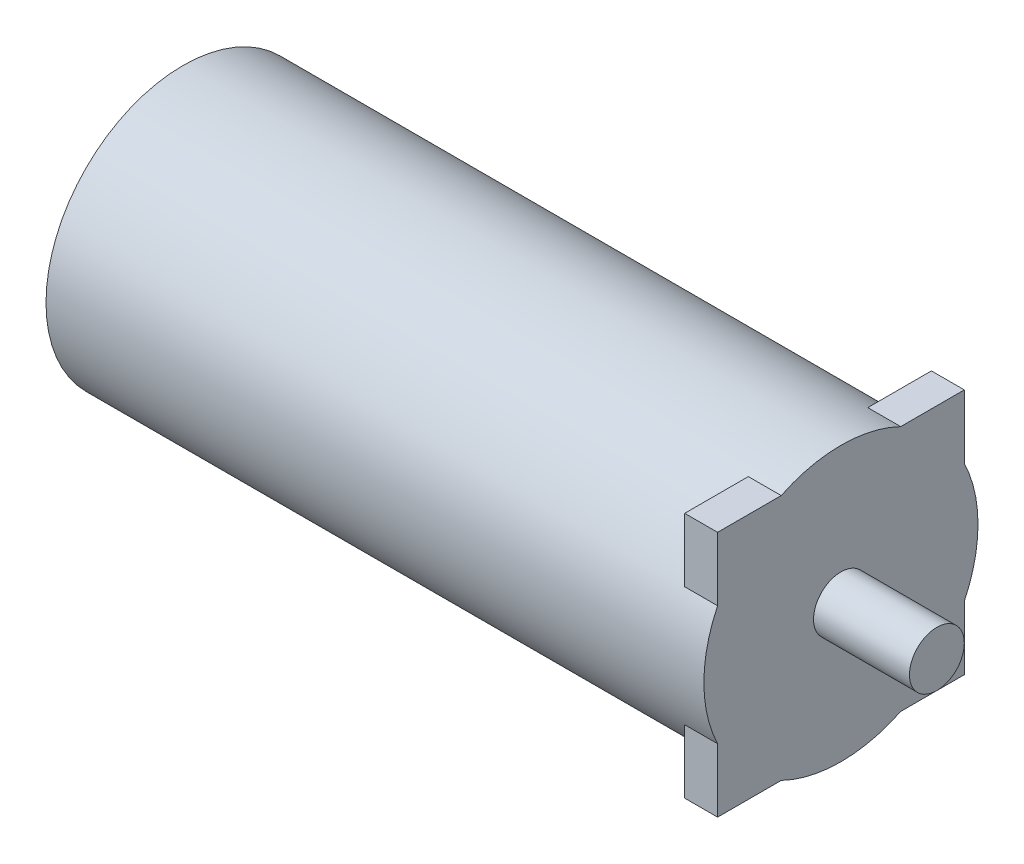
ISO-10303-21;
HEADER;
FILE_DESCRIPTION(('STEP AP214'),'2;1');
FILE_NAME('part.step','',(''),(''),'','','');
FILE_SCHEMA(('AUTOMOTIVE_DESIGN { 1 0 10303 214 1 1 1 1 }'));
ENDSEC;
DATA;
#1=APPLICATION_CONTEXT('core data for automotive mechanical design processes');
#2=APPLICATION_PROTOCOL_DEFINITION('international standard','automotive_design',2000,#1);
#3=PRODUCT_CONTEXT('',#1,'mechanical');
#4=PRODUCT('Part','Part','',(#3));
#5=PRODUCT_RELATED_PRODUCT_CATEGORY('part','',(#4));
#6=PRODUCT_DEFINITION_FORMATION('','',#4);
#7=PRODUCT_DEFINITION_CONTEXT('part definition',#1,'design');
#8=PRODUCT_DEFINITION('design','',#6,#7);
#9=PRODUCT_DEFINITION_SHAPE('','',#8);
#10=(LENGTH_UNIT() NAMED_UNIT(*) SI_UNIT(.MILLI.,.METRE.));
#11=(NAMED_UNIT(*) PLANE_ANGLE_UNIT() SI_UNIT($,.RADIAN.));
#12=(NAMED_UNIT(*) SI_UNIT($,.STERADIAN.) SOLID_ANGLE_UNIT());
#13=UNCERTAINTY_MEASURE_WITH_UNIT(LENGTH_MEASURE(1.E-05),#10,'distance_accuracy_value','');
#14=(GEOMETRIC_REPRESENTATION_CONTEXT(3) GLOBAL_UNCERTAINTY_ASSIGNED_CONTEXT((#13)) GLOBAL_UNIT_ASSIGNED_CONTEXT((#10,
#11,#12)) REPRESENTATION_CONTEXT('',''));
#15=CARTESIAN_POINT('',(0.,0.,0.));
#16=DIRECTION('',(0.,0.,1.));
#17=DIRECTION('',(1.,0.,0.));
#18=AXIS2_PLACEMENT_3D('',#15,#16,#17);
#19=CARTESIAN_POINT('',(-12.,-45.,45.));
#20=DIRECTION('',(0.,0.,-1.));
#21=DIRECTION('',(-1.,0.,0.));
#22=AXIS2_PLACEMENT_3D('',#19,#20,#21);
#23=PLANE('',#22);
#24=DIRECTION('',(0.,1.,0.));
#25=VECTOR('',#24,1.);
#26=CARTESIAN_POINT('',(-12.,-45.,45.));
#27=LINE('',#26,#25);
#28=CARTESIAN_POINT('',(-12.,21.7944947177034,45.));
#29=VERTEX_POINT('',#28);
#30=CARTESIAN_POINT('',(-12.,45.,45.));
#31=VERTEX_POINT('',#30);
#32=EDGE_CURVE('E141',#29,#31,#27,.T.);
#33=ORIENTED_EDGE('',*,*,#32,.F.);
#34=DIRECTION('',(1.,0.,0.));
#35=VECTOR('',#34,1.);
#36=CARTESIAN_POINT('',(-240.,21.7944947177034,45.));
#37=LINE('',#36,#35);
#38=CARTESIAN_POINT('',(0.,21.7944947177034,45.));
#39=VERTEX_POINT('',#38);
#40=EDGE_CURVE('E195',#29,#39,#37,.T.);
#41=ORIENTED_EDGE('',*,*,#40,.T.);
#42=DIRECTION('',(0.,1.,0.));
#43=VECTOR('',#42,1.);
#44=CARTESIAN_POINT('',(0.,-45.,45.));
#45=LINE('',#44,#43);
#46=CARTESIAN_POINT('',(0.,45.,45.));
#47=VERTEX_POINT('',#46);
#48=EDGE_CURVE('E197',#39,#47,#45,.T.);
#49=ORIENTED_EDGE('',*,*,#48,.T.);
#50=DIRECTION('',(1.,0.,0.));
#51=VECTOR('',#50,1.);
#52=CARTESIAN_POINT('',(-12.,45.,45.));
#53=LINE('',#52,#51);
#54=EDGE_CURVE('E54',#31,#47,#53,.T.);
#55=ORIENTED_EDGE('',*,*,#54,.F.);
#56=EDGE_LOOP('',(#33,#41,#49,#55));
#57=FACE_BOUND('',#56,.T.);
#58=ADVANCED_FACE('F45',(#57),#23,.F.);
#59=CARTESIAN_POINT('',(-12.,45.,45.));
#60=DIRECTION('',(0.,-1.,0.));
#61=DIRECTION('',(0.,0.,-1.));
#62=AXIS2_PLACEMENT_3D('',#59,#60,#61);
#63=PLANE('',#62);
#64=DIRECTION('',(0.,0.,-1.));
#65=VECTOR('',#64,1.);
#66=CARTESIAN_POINT('',(-12.,45.,45.));
#67=LINE('',#66,#65);
#68=CARTESIAN_POINT('',(-12.,45.,-21.7944947177034));
#69=VERTEX_POINT('',#68);
#70=CARTESIAN_POINT('',(-12.,45.,-45.));
#71=VERTEX_POINT('',#70);
#72=EDGE_CURVE('E140',#69,#71,#67,.T.);
#73=ORIENTED_EDGE('',*,*,#72,.F.);
#74=DIRECTION('',(1.,0.,0.));
#75=VECTOR('',#74,1.);
#76=CARTESIAN_POINT('',(-240.,45.,-21.7944947177034));
#77=LINE('',#76,#75);
#78=CARTESIAN_POINT('',(0.,45.,-21.7944947177034));
#79=VERTEX_POINT('',#78);
#80=EDGE_CURVE('E172',#69,#79,#77,.T.);
#81=ORIENTED_EDGE('',*,*,#80,.T.);
#82=DIRECTION('',(0.,0.,-1.));
#83=VECTOR('',#82,1.);
#84=CARTESIAN_POINT('',(0.,45.,45.));
#85=LINE('',#84,#83);
#86=CARTESIAN_POINT('',(0.,45.,-45.));
#87=VERTEX_POINT('',#86);
#88=EDGE_CURVE('E214',#79,#87,#85,.T.);
#89=ORIENTED_EDGE('',*,*,#88,.T.);
#90=DIRECTION('',(1.,0.,0.));
#91=VECTOR('',#90,1.);
#92=CARTESIAN_POINT('',(-12.,45.,-45.));
#93=LINE('',#92,#91);
#94=EDGE_CURVE('E234',#71,#87,#93,.T.);
#95=ORIENTED_EDGE('',*,*,#94,.F.);
#96=EDGE_LOOP('',(#73,#81,#89,#95));
#97=FACE_BOUND('',#96,.T.);
#98=ADVANCED_FACE('F294',(#97),#63,.F.);
#99=CARTESIAN_POINT('',(-12.,-45.,-45.));
#100=DIRECTION('',(0.,0.,-1.));
#101=DIRECTION('',(-1.,0.,0.));
#102=AXIS2_PLACEMENT_3D('',#99,#100,#101);
#103=PLANE('',#102);
#104=DIRECTION('',(1.,0.,0.));
#105=VECTOR('',#104,1.);
#106=CARTESIAN_POINT('',(-240.,21.7944947177034,-45.));
#107=LINE('',#106,#105);
#108=CARTESIAN_POINT('',(-12.,21.7944947177034,-45.));
#109=VERTEX_POINT('',#108);
#110=CARTESIAN_POINT('',(0.,21.7944947177034,-45.));
#111=VERTEX_POINT('',#110);
#112=EDGE_CURVE('E182',#109,#111,#107,.T.);
#113=ORIENTED_EDGE('',*,*,#112,.F.);
#114=DIRECTION('',(0.,1.,0.));
#115=VECTOR('',#114,1.);
#116=CARTESIAN_POINT('',(-12.,-45.,-45.));
#117=LINE('',#116,#115);
#118=EDGE_CURVE('E203',#109,#71,#117,.T.);
#119=ORIENTED_EDGE('',*,*,#118,.T.);
#120=ORIENTED_EDGE('',*,*,#94,.T.);
#121=DIRECTION('',(0.,1.,0.));
#122=VECTOR('',#121,1.);
#123=CARTESIAN_POINT('',(0.,-45.,-45.));
#124=LINE('',#123,#122);
#125=EDGE_CURVE('E218',#111,#87,#124,.T.);
#126=ORIENTED_EDGE('',*,*,#125,.F.);
#127=EDGE_LOOP('',(#113,#119,#120,#126));
#128=FACE_BOUND('',#127,.T.);
#129=ADVANCED_FACE('F298',(#128),#103,.T.);
#130=CARTESIAN_POINT('',(-12.,-45.,45.));
#131=DIRECTION('',(0.,-1.,0.));
#132=DIRECTION('',(0.,0.,-1.));
#133=AXIS2_PLACEMENT_3D('',#130,#131,#132);
#134=PLANE('',#133);
#135=DIRECTION('',(1.,0.,0.));
#136=VECTOR('',#135,1.);
#137=CARTESIAN_POINT('',(-240.,-45.,-21.7944947177034));
#138=LINE('',#137,#136);
#139=CARTESIAN_POINT('',(-12.,-45.,-21.7944947177034));
#140=VERTEX_POINT('',#139);
#141=CARTESIAN_POINT('',(0.,-45.,-21.7944947177034));
#142=VERTEX_POINT('',#141);
#143=EDGE_CURVE('E61',#140,#142,#138,.T.);
#144=ORIENTED_EDGE('',*,*,#143,.F.);
#145=DIRECTION('',(0.,0.,-1.));
#146=VECTOR('',#145,1.);
#147=CARTESIAN_POINT('',(-12.,-45.,45.));
#148=LINE('',#147,#146);
#149=CARTESIAN_POINT('',(-12.,-45.,-45.));
#150=VERTEX_POINT('',#149);
#151=EDGE_CURVE('E208',#140,#150,#148,.T.);
#152=ORIENTED_EDGE('',*,*,#151,.T.);
#153=DIRECTION('',(1.,0.,0.));
#154=VECTOR('',#153,1.);
#155=CARTESIAN_POINT('',(-12.,-45.,-45.));
#156=LINE('',#155,#154);
#157=CARTESIAN_POINT('',(0.,-45.,-45.));
#158=VERTEX_POINT('',#157);
#159=EDGE_CURVE('E230',#150,#158,#156,.T.);
#160=ORIENTED_EDGE('',*,*,#159,.T.);
#161=DIRECTION('',(0.,0.,-1.));
#162=VECTOR('',#161,1.);
#163=CARTESIAN_POINT('',(0.,-45.,45.));
#164=LINE('',#163,#162);
#165=EDGE_CURVE('E223',#142,#158,#164,.T.);
#166=ORIENTED_EDGE('',*,*,#165,.F.);
#167=EDGE_LOOP('',(#144,#152,#160,#166));
#168=FACE_BOUND('',#167,.T.);
#169=ADVANCED_FACE('F362',(#168),#134,.T.);
#170=CARTESIAN_POINT('',(-12.,0.,0.));
#171=DIRECTION('',(-1.,0.,0.));
#172=DIRECTION('',(0.,0.,1.));
#173=AXIS2_PLACEMENT_3D('',#170,#171,#172);
#174=PLANE('',#173);
#175=CARTESIAN_POINT('',(-12.,0.,0.));
#176=DIRECTION('',(-1.,0.,0.));
#177=DIRECTION('',(0.,0.,1.));
#178=AXIS2_PLACEMENT_3D('',#175,#176,#177);
#179=CIRCLE('',#178,50.);
#180=CARTESIAN_POINT('',(-12.,45.,21.7944947177034));
#181=VERTEX_POINT('',#180);
#182=EDGE_CURVE('E161',#29,#181,#179,.T.);
#183=ORIENTED_EDGE('',*,*,#182,.F.);
#184=ORIENTED_EDGE('',*,*,#32,.T.);
#185=EDGE_CURVE('E199',#31,#181,#67,.T.);
#186=ORIENTED_EDGE('',*,*,#185,.T.);
#187=EDGE_LOOP('',(#183,#184,#186));
#188=FACE_BOUND('',#187,.T.);
#189=ADVANCED_FACE('F290',(#188),#174,.T.);
#190=EDGE_CURVE('E173',#69,#109,#179,.T.);
#191=ORIENTED_EDGE('',*,*,#190,.F.);
#192=ORIENTED_EDGE('',*,*,#72,.T.);
#193=ORIENTED_EDGE('',*,*,#118,.F.);
#194=EDGE_LOOP('',(#191,#192,#193));
#195=FACE_BOUND('',#194,.T.);
#196=ADVANCED_FACE('F306',(#195),#174,.T.);
#197=CARTESIAN_POINT('',(-12.,-21.7944947177034,-45.));
#198=VERTEX_POINT('',#197);
#199=EDGE_CURVE('E151',#198,#140,#179,.T.);
#200=ORIENTED_EDGE('',*,*,#199,.F.);
#201=EDGE_CURVE('E204',#150,#198,#117,.T.);
#202=ORIENTED_EDGE('',*,*,#201,.F.);
#203=ORIENTED_EDGE('',*,*,#151,.F.);
#204=EDGE_LOOP('',(#200,#202,#203));
#205=FACE_BOUND('',#204,.T.);
#206=ADVANCED_FACE('F291',(#205),#174,.T.);
#207=CARTESIAN_POINT('',(0.,-45.,45.));
#208=VERTEX_POINT('',#207);
#209=CARTESIAN_POINT('',(0.,-21.7944947177034,45.));
#210=VERTEX_POINT('',#209);
#211=EDGE_CURVE('E146',#208,#210,#45,.T.);
#212=ORIENTED_EDGE('',*,*,#211,.T.);
#213=DIRECTION('',(1.,0.,0.));
#214=VECTOR('',#213,1.);
#215=CARTESIAN_POINT('',(-240.,-21.7944947177034,45.));
#216=LINE('',#215,#214);
#217=CARTESIAN_POINT('',(-12.,-21.7944947177034,45.));
#218=VERTEX_POINT('',#217);
#219=EDGE_CURVE('E144',#210,#218,#216,.F.);
#220=ORIENTED_EDGE('',*,*,#219,.T.);
#221=CARTESIAN_POINT('',(-12.,-45.,45.));
#222=VERTEX_POINT('',#221);
#223=EDGE_CURVE('E134',#222,#218,#27,.T.);
#224=ORIENTED_EDGE('',*,*,#223,.F.);
#225=DIRECTION('',(1.,0.,0.));
#226=VECTOR('',#225,1.);
#227=CARTESIAN_POINT('',(-12.,-45.,45.));
#228=LINE('',#227,#226);
#229=EDGE_CURVE('E211',#222,#208,#228,.T.);
#230=ORIENTED_EDGE('',*,*,#229,.T.);
#231=EDGE_LOOP('',(#212,#220,#224,#230));
#232=FACE_BOUND('',#231,.T.);
#233=ADVANCED_FACE('F47',(#232),#23,.F.);
#234=CARTESIAN_POINT('',(0.,45.,21.7944947177034));
#235=VERTEX_POINT('',#234);
#236=EDGE_CURVE('E215',#47,#235,#85,.T.);
#237=ORIENTED_EDGE('',*,*,#236,.T.);
#238=DIRECTION('',(1.,0.,0.));
#239=VECTOR('',#238,1.);
#240=CARTESIAN_POINT('',(-240.,45.,21.7944947177034));
#241=LINE('',#240,#239);
#242=EDGE_CURVE('E171',#235,#181,#241,.F.);
#243=ORIENTED_EDGE('',*,*,#242,.T.);
#244=ORIENTED_EDGE('',*,*,#185,.F.);
#245=ORIENTED_EDGE('',*,*,#54,.T.);
#246=EDGE_LOOP('',(#237,#243,#244,#245));
#247=FACE_BOUND('',#246,.T.);
#248=ADVANCED_FACE('F242',(#247),#63,.F.);
#249=DIRECTION('',(1.,0.,0.));
#250=VECTOR('',#249,1.);
#251=CARTESIAN_POINT('',(-240.,-21.7944947177034,-45.));
#252=LINE('',#251,#250);
#253=CARTESIAN_POINT('',(0.,-21.7944947177034,-45.));
#254=VERTEX_POINT('',#253);
#255=EDGE_CURVE('E178',#254,#198,#252,.F.);
#256=ORIENTED_EDGE('',*,*,#255,.F.);
#257=EDGE_CURVE('E219',#158,#254,#124,.T.);
#258=ORIENTED_EDGE('',*,*,#257,.F.);
#259=ORIENTED_EDGE('',*,*,#159,.F.);
#260=ORIENTED_EDGE('',*,*,#201,.T.);
#261=EDGE_LOOP('',(#256,#258,#259,#260));
#262=FACE_BOUND('',#261,.T.);
#263=ADVANCED_FACE('F305',(#262),#103,.T.);
#264=DIRECTION('',(1.,0.,0.));
#265=VECTOR('',#264,1.);
#266=CARTESIAN_POINT('',(-240.,-45.,21.7944947177034));
#267=LINE('',#266,#265);
#268=CARTESIAN_POINT('',(0.,-45.,21.7944947177034));
#269=VERTEX_POINT('',#268);
#270=CARTESIAN_POINT('',(-12.,-45.,21.7944947177034));
#271=VERTEX_POINT('',#270);
#272=EDGE_CURVE('E152',#269,#271,#267,.F.);
#273=ORIENTED_EDGE('',*,*,#272,.F.);
#274=EDGE_CURVE('E224',#208,#269,#164,.T.);
#275=ORIENTED_EDGE('',*,*,#274,.F.);
#276=ORIENTED_EDGE('',*,*,#229,.F.);
#277=EDGE_CURVE('E137',#222,#271,#148,.T.);
#278=ORIENTED_EDGE('',*,*,#277,.T.);
#279=EDGE_LOOP('',(#273,#275,#276,#278));
#280=FACE_BOUND('',#279,.T.);
#281=ADVANCED_FACE('F288',(#280),#134,.T.);
#282=EDGE_CURVE('E69',#271,#218,#179,.T.);
#283=ORIENTED_EDGE('',*,*,#282,.F.);
#284=ORIENTED_EDGE('',*,*,#277,.F.);
#285=ORIENTED_EDGE('',*,*,#223,.T.);
#286=EDGE_LOOP('',(#283,#284,#285));
#287=FACE_BOUND('',#286,.T.);
#288=ADVANCED_FACE('F136',(#287),#174,.T.);
#289=CARTESIAN_POINT('',(0.,0.,0.));
#290=DIRECTION('',(-1.,0.,0.));
#291=DIRECTION('',(0.,0.,1.));
#292=AXIS2_PLACEMENT_3D('',#289,#290,#291);
#293=PLANE('',#292);
#294=CARTESIAN_POINT('',(0.,0.,0.));
#295=DIRECTION('',(-1.,0.,0.));
#296=DIRECTION('',(0.,0.,1.));
#297=AXIS2_PLACEMENT_3D('',#294,#295,#296);
#298=CIRCLE('',#297,10.);
#299=CARTESIAN_POINT('',(0.,0.,10.));
#300=VERTEX_POINT('',#299);
#301=EDGE_CURVE('E11',#300,#300,#298,.F.);
#302=ORIENTED_EDGE('',*,*,#301,.F.);
#303=EDGE_LOOP('',(#302));
#304=FACE_BOUND('',#303,.T.);
#305=ORIENTED_EDGE('',*,*,#274,.T.);
#306=CARTESIAN_POINT('',(0.,0.,0.));
#307=DIRECTION('',(1.,0.,0.));
#308=DIRECTION('',(0.,0.,-1.));
#309=AXIS2_PLACEMENT_3D('',#306,#307,#308);
#310=CIRCLE('',#309,50.);
#311=EDGE_CURVE('E259',#269,#142,#310,.T.);
#312=ORIENTED_EDGE('',*,*,#311,.T.);
#313=ORIENTED_EDGE('',*,*,#165,.T.);
#314=ORIENTED_EDGE('',*,*,#257,.T.);
#315=EDGE_CURVE('E257',#254,#111,#310,.T.);
#316=ORIENTED_EDGE('',*,*,#315,.T.);
#317=ORIENTED_EDGE('',*,*,#125,.T.);
#318=ORIENTED_EDGE('',*,*,#88,.F.);
#319=EDGE_CURVE('E166',#79,#235,#310,.T.);
#320=ORIENTED_EDGE('',*,*,#319,.T.);
#321=ORIENTED_EDGE('',*,*,#236,.F.);
#322=ORIENTED_EDGE('',*,*,#48,.F.);
#323=EDGE_CURVE('E256',#39,#210,#310,.T.);
#324=ORIENTED_EDGE('',*,*,#323,.T.);
#325=ORIENTED_EDGE('',*,*,#211,.F.);
#326=EDGE_LOOP('',(#305,#312,#313,#314,#316,#317,#318,#320,#321,#322,#324,#325));
#327=FACE_BOUND('',#326,.T.);
#328=ADVANCED_FACE('F251',(#304,#327),#293,.F.);
#329=CARTESIAN_POINT('',(-240.,0.,0.));
#330=DIRECTION('',(1.,0.,0.));
#331=DIRECTION('',(0.,0.,-1.));
#332=AXIS2_PLACEMENT_3D('',#329,#330,#331);
#333=CYLINDRICAL_SURFACE('',#332,50.);
#334=CARTESIAN_POINT('',(-240.,0.,0.));
#335=DIRECTION('',(1.,0.,0.));
#336=DIRECTION('',(0.,0.,-1.));
#337=AXIS2_PLACEMENT_3D('',#334,#335,#336);
#338=CIRCLE('',#337,50.);
#339=CARTESIAN_POINT('',(-240.,0.,-50.));
#340=VERTEX_POINT('',#339);
#341=EDGE_CURVE('E159',#340,#340,#338,.T.);
#342=ORIENTED_EDGE('',*,*,#341,.T.);
#343=EDGE_LOOP('',(#342));
#344=FACE_BOUND('',#343,.T.);
#345=ORIENTED_EDGE('',*,*,#40,.F.);
#346=ORIENTED_EDGE('',*,*,#182,.T.);
#347=ORIENTED_EDGE('',*,*,#242,.F.);
#348=ORIENTED_EDGE('',*,*,#319,.F.);
#349=ORIENTED_EDGE('',*,*,#80,.F.);
#350=ORIENTED_EDGE('',*,*,#190,.T.);
#351=ORIENTED_EDGE('',*,*,#112,.T.);
#352=ORIENTED_EDGE('',*,*,#315,.F.);
#353=ORIENTED_EDGE('',*,*,#255,.T.);
#354=ORIENTED_EDGE('',*,*,#199,.T.);
#355=ORIENTED_EDGE('',*,*,#143,.T.);
#356=ORIENTED_EDGE('',*,*,#311,.F.);
#357=ORIENTED_EDGE('',*,*,#272,.T.);
#358=ORIENTED_EDGE('',*,*,#282,.T.);
#359=ORIENTED_EDGE('',*,*,#219,.F.);
#360=ORIENTED_EDGE('',*,*,#323,.F.);
#361=EDGE_LOOP('',(#345,#346,#347,#348,#349,#350,#351,#352,#353,#354,#355,#356,#357,#358,#359,#360));
#362=FACE_BOUND('',#361,.T.);
#363=ADVANCED_FACE('F156',(#344,#362),#333,.T.);
#364=CARTESIAN_POINT('',(-240.,0.,0.));
#365=DIRECTION('',(1.,0.,0.));
#366=DIRECTION('',(0.,0.,-1.));
#367=AXIS2_PLACEMENT_3D('',#364,#365,#366);
#368=PLANE('',#367);
#369=ORIENTED_EDGE('',*,*,#341,.F.);
#370=EDGE_LOOP('',(#369));
#371=FACE_BOUND('',#370,.T.);
#372=ADVANCED_FACE('F275',(#371),#368,.F.);
#373=CARTESIAN_POINT('',(35.,0.,0.));
#374=DIRECTION('',(-1.,0.,0.));
#375=DIRECTION('',(0.,0.,1.));
#376=AXIS2_PLACEMENT_3D('',#373,#374,#375);
#377=CYLINDRICAL_SURFACE('',#376,10.);
#378=CARTESIAN_POINT('',(35.,0.,0.));
#379=DIRECTION('',(1.,0.,0.));
#380=DIRECTION('',(0.,0.,-1.));
#381=AXIS2_PLACEMENT_3D('',#378,#379,#380);
#382=CIRCLE('',#381,10.);
#383=CARTESIAN_POINT('',(35.,0.,-10.));
#384=VERTEX_POINT('',#383);
#385=EDGE_CURVE('E262',#384,#384,#382,.T.);
#386=ORIENTED_EDGE('',*,*,#385,.F.);
#387=EDGE_LOOP('',(#386));
#388=FACE_BOUND('',#387,.T.);
#389=ORIENTED_EDGE('',*,*,#301,.T.);
#390=EDGE_LOOP('',(#389));
#391=FACE_BOUND('',#390,.T.);
#392=ADVANCED_FACE('F272',(#388,#391),#377,.T.);
#393=CARTESIAN_POINT('',(35.,0.,0.));
#394=DIRECTION('',(1.,0.,0.));
#395=DIRECTION('',(0.,0.,-1.));
#396=AXIS2_PLACEMENT_3D('',#393,#394,#395);
#397=PLANE('',#396);
#398=ORIENTED_EDGE('',*,*,#385,.T.);
#399=EDGE_LOOP('',(#398));
#400=FACE_BOUND('',#399,.T.);
#401=ADVANCED_FACE('F270',(#400),#397,.T.);
#402=CLOSED_SHELL('',(#58,#98,#129,#169,#189,#196,#206,#233,#248,#263,#281,#288,#328,#363,#372,
#392,#401));
#403=MANIFOLD_SOLID_BREP('B2',#402);
#404=ADVANCED_BREP_SHAPE_REPRESENTATION('',(#18,#403),#14);
#405=SHAPE_DEFINITION_REPRESENTATION(#9,#404);
ENDSEC;
END-ISO-10303-21;
